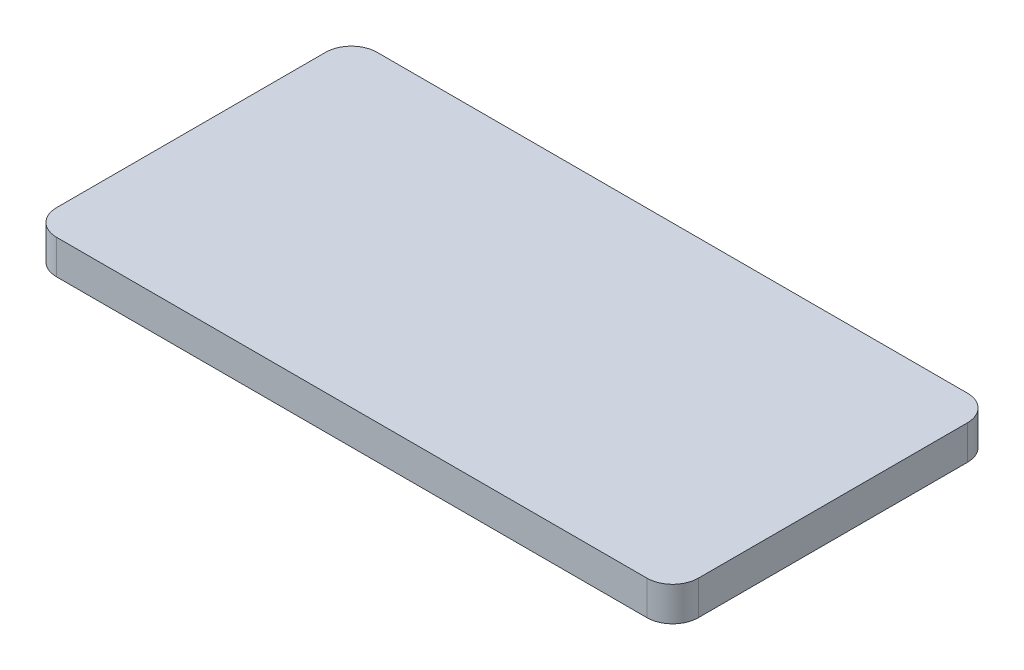
ISO-10303-21;
HEADER;
FILE_DESCRIPTION(('STEP AP214'),'2;1');
FILE_NAME('part.step','',(''),(''),'','','');
FILE_SCHEMA(('AUTOMOTIVE_DESIGN { 1 0 10303 214 1 1 1 1 }'));
ENDSEC;
DATA;
#1=APPLICATION_CONTEXT('core data for automotive mechanical design processes');
#2=APPLICATION_PROTOCOL_DEFINITION('international standard','automotive_design',2000,#1);
#3=PRODUCT_CONTEXT('',#1,'mechanical');
#4=PRODUCT('Part','Part','',(#3));
#5=PRODUCT_RELATED_PRODUCT_CATEGORY('part','',(#4));
#6=PRODUCT_DEFINITION_FORMATION('','',#4);
#7=PRODUCT_DEFINITION_CONTEXT('part definition',#1,'design');
#8=PRODUCT_DEFINITION('design','',#6,#7);
#9=PRODUCT_DEFINITION_SHAPE('','',#8);
#10=(LENGTH_UNIT() NAMED_UNIT(*) SI_UNIT(.MILLI.,.METRE.));
#11=(NAMED_UNIT(*) PLANE_ANGLE_UNIT() SI_UNIT($,.RADIAN.));
#12=(NAMED_UNIT(*) SI_UNIT($,.STERADIAN.) SOLID_ANGLE_UNIT());
#13=UNCERTAINTY_MEASURE_WITH_UNIT(LENGTH_MEASURE(1.E-05),#10,'distance_accuracy_value','');
#14=(GEOMETRIC_REPRESENTATION_CONTEXT(3) GLOBAL_UNCERTAINTY_ASSIGNED_CONTEXT((#13)) GLOBAL_UNIT_ASSIGNED_CONTEXT((#10,
#11,#12)) REPRESENTATION_CONTEXT('',''));
#15=CARTESIAN_POINT('',(0.,0.,0.));
#16=DIRECTION('',(0.,0.,1.));
#17=DIRECTION('',(1.,0.,0.));
#18=AXIS2_PLACEMENT_3D('',#15,#16,#17);
#19=CARTESIAN_POINT('',(143.8,0.,6.));
#20=DIRECTION('',(0.,-1.,0.));
#21=DIRECTION('',(0.,0.,-1.));
#22=AXIS2_PLACEMENT_3D('',#19,#20,#21);
#23=PLANE('',#22);
#24=CARTESIAN_POINT('',(19.,0.,37.4));
#25=DIRECTION('',(0.,-1.,0.));
#26=DIRECTION('',(0.,0.,-1.));
#27=AXIS2_PLACEMENT_3D('',#24,#25,#26);
#28=CIRCLE('',#27,3.59999999999999);
#29=CARTESIAN_POINT('',(19.,0.,41.));
#30=VERTEX_POINT('',#29);
#31=EDGE_CURVE('E130',#30,#30,#28,.T.);
#32=ORIENTED_EDGE('',*,*,#31,.F.);
#33=EDGE_LOOP('',(#32));
#34=FACE_BOUND('',#33,.T.);
#35=CARTESIAN_POINT('',(63.2,0.,9.34999999999999));
#36=DIRECTION('',(0.,-1.,0.));
#37=DIRECTION('',(0.,0.,-1.));
#38=AXIS2_PLACEMENT_3D('',#35,#36,#37);
#39=CIRCLE('',#38,1.65);
#40=CARTESIAN_POINT('',(63.2,0.,7.69999999999998));
#41=VERTEX_POINT('',#40);
#42=EDGE_CURVE('E162',#41,#41,#39,.T.);
#43=ORIENTED_EDGE('',*,*,#42,.F.);
#44=EDGE_LOOP('',(#43));
#45=FACE_BOUND('',#44,.T.);
#46=CARTESIAN_POINT('',(103.2,0.,64.25));
#47=DIRECTION('',(0.,-1.,0.));
#48=DIRECTION('',(0.,0.,-1.));
#49=AXIS2_PLACEMENT_3D('',#46,#47,#48);
#50=CIRCLE('',#49,1.65);
#51=CARTESIAN_POINT('',(103.2,0.,62.6));
#52=VERTEX_POINT('',#51);
#53=EDGE_CURVE('E169',#52,#52,#50,.T.);
#54=ORIENTED_EDGE('',*,*,#53,.F.);
#55=EDGE_LOOP('',(#54));
#56=FACE_BOUND('',#55,.T.);
#57=CARTESIAN_POINT('',(63.2,0.,64.25));
#58=DIRECTION('',(0.,-1.,0.));
#59=DIRECTION('',(0.,0.,-1.));
#60=AXIS2_PLACEMENT_3D('',#57,#58,#59);
#61=CIRCLE('',#60,1.65);
#62=CARTESIAN_POINT('',(63.2,0.,62.6));
#63=VERTEX_POINT('',#62);
#64=EDGE_CURVE('E175',#63,#63,#61,.T.);
#65=ORIENTED_EDGE('',*,*,#64,.F.);
#66=EDGE_LOOP('',(#65));
#67=FACE_BOUND('',#66,.T.);
#68=CARTESIAN_POINT('',(103.2,0.,9.34999999999999));
#69=DIRECTION('',(0.,-1.,0.));
#70=DIRECTION('',(0.,0.,-1.));
#71=AXIS2_PLACEMENT_3D('',#68,#69,#70);
#72=CIRCLE('',#71,1.65);
#73=CARTESIAN_POINT('',(103.2,0.,7.69999999999999));
#74=VERTEX_POINT('',#73);
#75=EDGE_CURVE('E165',#74,#74,#72,.T.);
#76=ORIENTED_EDGE('',*,*,#75,.F.);
#77=EDGE_LOOP('',(#76));
#78=FACE_BOUND('',#77,.T.);
#79=CARTESIAN_POINT('',(5.05,0.,3.24999999999999));
#80=DIRECTION('',(0.,-1.,0.));
#81=DIRECTION('',(0.,0.,-1.));
#82=AXIS2_PLACEMENT_3D('',#79,#80,#81);
#83=CIRCLE('',#82,1.25000000000001);
#84=CARTESIAN_POINT('',(5.05,0.,1.99999999999998));
#85=VERTEX_POINT('',#84);
#86=EDGE_CURVE('E186',#85,#85,#83,.T.);
#87=ORIENTED_EDGE('',*,*,#86,.F.);
#88=EDGE_LOOP('',(#87));
#89=FACE_BOUND('',#88,.T.);
#90=CARTESIAN_POINT('',(5.05,0.,71.05));
#91=DIRECTION('',(0.,-1.,0.));
#92=DIRECTION('',(0.,0.,-1.));
#93=AXIS2_PLACEMENT_3D('',#90,#91,#92);
#94=CIRCLE('',#93,1.25000000000001);
#95=CARTESIAN_POINT('',(5.05,0.,69.8));
#96=VERTEX_POINT('',#95);
#97=EDGE_CURVE('E192',#96,#96,#94,.T.);
#98=ORIENTED_EDGE('',*,*,#97,.F.);
#99=EDGE_LOOP('',(#98));
#100=FACE_BOUND('',#99,.T.);
#101=CARTESIAN_POINT('',(22.8,0.,70.3));
#102=DIRECTION('',(0.,-1.,0.));
#103=DIRECTION('',(0.,0.,-1.));
#104=AXIS2_PLACEMENT_3D('',#101,#102,#103);
#105=CIRCLE('',#104,1.25000000000001);
#106=CARTESIAN_POINT('',(22.8,0.,69.05));
#107=VERTEX_POINT('',#106);
#108=EDGE_CURVE('E198',#107,#107,#105,.T.);
#109=ORIENTED_EDGE('',*,*,#108,.F.);
#110=EDGE_LOOP('',(#109));
#111=FACE_BOUND('',#110,.T.);
#112=CARTESIAN_POINT('',(48.1,0.,68.75));
#113=DIRECTION('',(0.,-1.,0.));
#114=DIRECTION('',(0.,0.,-1.));
#115=AXIS2_PLACEMENT_3D('',#112,#113,#114);
#116=CIRCLE('',#115,1.25);
#117=CARTESIAN_POINT('',(48.1,0.,67.5));
#118=VERTEX_POINT('',#117);
#119=EDGE_CURVE('E204',#118,#118,#116,.T.);
#120=ORIENTED_EDGE('',*,*,#119,.F.);
#121=EDGE_LOOP('',(#120));
#122=FACE_BOUND('',#121,.T.);
#123=CARTESIAN_POINT('',(47.7,0.,4.84999999999999));
#124=DIRECTION('',(0.,-1.,0.));
#125=DIRECTION('',(0.,0.,-1.));
#126=AXIS2_PLACEMENT_3D('',#123,#124,#125);
#127=CIRCLE('',#126,1.25);
#128=CARTESIAN_POINT('',(47.7,0.,3.59999999999999));
#129=VERTEX_POINT('',#128);
#130=EDGE_CURVE('E210',#129,#129,#127,.T.);
#131=ORIENTED_EDGE('',*,*,#130,.F.);
#132=EDGE_LOOP('',(#131));
#133=FACE_BOUND('',#132,.T.);
#134=CARTESIAN_POINT('',(131.1,0.,55.65));
#135=DIRECTION('',(0.,-1.,0.));
#136=DIRECTION('',(0.,0.,-1.));
#137=AXIS2_PLACEMENT_3D('',#134,#135,#136);
#138=CIRCLE('',#137,1.25000000000001);
#139=CARTESIAN_POINT('',(131.1,0.,54.4));
#140=VERTEX_POINT('',#139);
#141=EDGE_CURVE('E216',#140,#140,#138,.T.);
#142=ORIENTED_EDGE('',*,*,#141,.F.);
#143=EDGE_LOOP('',(#142));
#144=FACE_BOUND('',#143,.T.);
#145=CARTESIAN_POINT('',(130.8,0.,5.59999999999999));
#146=DIRECTION('',(0.,-1.,0.));
#147=DIRECTION('',(0.,0.,-1.));
#148=AXIS2_PLACEMENT_3D('',#145,#146,#147);
#149=CIRCLE('',#148,1.25000000000001);
#150=CARTESIAN_POINT('',(130.8,0.,4.34999999999998));
#151=VERTEX_POINT('',#150);
#152=EDGE_CURVE('E219',#151,#151,#149,.T.);
#153=ORIENTED_EDGE('',*,*,#152,.F.);
#154=EDGE_LOOP('',(#153));
#155=FACE_BOUND('',#154,.T.);
#156=CARTESIAN_POINT('',(143.8,0.,6.));
#157=DIRECTION('',(0.,1.,0.));
#158=DIRECTION('',(0.,0.,-1.));
#159=AXIS2_PLACEMENT_3D('',#156,#157,#158);
#160=CIRCLE('',#159,6.);
#161=CARTESIAN_POINT('',(149.8,0.,6.));
#162=VERTEX_POINT('',#161);
#163=CARTESIAN_POINT('',(143.8,0.,0.));
#164=VERTEX_POINT('',#163);
#165=EDGE_CURVE('E225',#162,#164,#160,.T.);
#166=ORIENTED_EDGE('',*,*,#165,.F.);
#167=DIRECTION('',(0.,0.,-1.));
#168=VECTOR('',#167,1.);
#169=CARTESIAN_POINT('',(149.8,0.,6.));
#170=LINE('',#169,#168);
#171=CARTESIAN_POINT('',(149.8,0.,68.8));
#172=VERTEX_POINT('',#171);
#173=EDGE_CURVE('E232',#172,#162,#170,.T.);
#174=ORIENTED_EDGE('',*,*,#173,.F.);
#175=CARTESIAN_POINT('',(143.8,0.,68.8));
#176=DIRECTION('',(0.,1.,0.));
#177=DIRECTION('',(0.,0.,1.));
#178=AXIS2_PLACEMENT_3D('',#175,#176,#177);
#179=CIRCLE('',#178,6.00000000000001);
#180=CARTESIAN_POINT('',(143.8,0.,74.8));
#181=VERTEX_POINT('',#180);
#182=EDGE_CURVE('E259',#181,#172,#179,.T.);
#183=ORIENTED_EDGE('',*,*,#182,.F.);
#184=DIRECTION('',(1.,0.,0.));
#185=VECTOR('',#184,1.);
#186=CARTESIAN_POINT('',(6.00000000000001,0.,74.8));
#187=LINE('',#186,#185);
#188=CARTESIAN_POINT('',(6.00000000000001,0.,74.8));
#189=VERTEX_POINT('',#188);
#190=EDGE_CURVE('E257',#189,#181,#187,.T.);
#191=ORIENTED_EDGE('',*,*,#190,.F.);
#192=CARTESIAN_POINT('',(6.00000000000001,0.,68.8));
#193=DIRECTION('',(0.,1.,0.));
#194=DIRECTION('',(0.,0.,1.));
#195=AXIS2_PLACEMENT_3D('',#192,#193,#194);
#196=CIRCLE('',#195,6.);
#197=CARTESIAN_POINT('',(0.,0.,68.8));
#198=VERTEX_POINT('',#197);
#199=EDGE_CURVE('E255',#198,#189,#196,.T.);
#200=ORIENTED_EDGE('',*,*,#199,.F.);
#201=DIRECTION('',(0.,0.,1.));
#202=VECTOR('',#201,1.);
#203=CARTESIAN_POINT('',(0.,0.,6.));
#204=LINE('',#203,#202);
#205=CARTESIAN_POINT('',(0.,0.,6.));
#206=VERTEX_POINT('',#205);
#207=EDGE_CURVE('E253',#206,#198,#204,.T.);
#208=ORIENTED_EDGE('',*,*,#207,.F.);
#209=CARTESIAN_POINT('',(6.,0.,6.));
#210=DIRECTION('',(0.,1.,0.));
#211=DIRECTION('',(0.,0.,1.));
#212=AXIS2_PLACEMENT_3D('',#209,#210,#211);
#213=CIRCLE('',#212,6.);
#214=CARTESIAN_POINT('',(6.,0.,0.));
#215=VERTEX_POINT('',#214);
#216=EDGE_CURVE('E251',#215,#206,#213,.T.);
#217=ORIENTED_EDGE('',*,*,#216,.F.);
#218=DIRECTION('',(-1.,0.,0.));
#219=VECTOR('',#218,1.);
#220=CARTESIAN_POINT('',(6.,0.,0.));
#221=LINE('',#220,#219);
#222=EDGE_CURVE('E249',#164,#215,#221,.T.);
#223=ORIENTED_EDGE('',*,*,#222,.F.);
#224=EDGE_LOOP('',(#166,#174,#183,#191,#200,#208,#217,#223));
#225=FACE_BOUND('',#224,.T.);
#226=DIRECTION('',(-1.,0.,0.));
#227=VECTOR('',#226,1.);
#228=CARTESIAN_POINT('',(30.8,0.,40.15));
#229=LINE('',#228,#227);
#230=CARTESIAN_POINT('',(30.8,0.,40.15));
#231=VERTEX_POINT('',#230);
#232=CARTESIAN_POINT('',(27.3,0.,40.15));
#233=VERTEX_POINT('',#232);
#234=EDGE_CURVE('E52',#231,#233,#229,.T.);
#235=ORIENTED_EDGE('',*,*,#234,.F.);
#236=DIRECTION('',(0.,0.,1.));
#237=VECTOR('',#236,1.);
#238=CARTESIAN_POINT('',(30.8,0.,34.65));
#239=LINE('',#238,#237);
#240=CARTESIAN_POINT('',(30.8,0.,34.65));
#241=VERTEX_POINT('',#240);
#242=EDGE_CURVE('E123',#241,#231,#239,.T.);
#243=ORIENTED_EDGE('',*,*,#242,.F.);
#244=DIRECTION('',(-1.,0.,0.));
#245=VECTOR('',#244,1.);
#246=CARTESIAN_POINT('',(30.8,0.,34.65));
#247=LINE('',#246,#245);
#248=CARTESIAN_POINT('',(27.3,0.,34.65));
#249=VERTEX_POINT('',#248);
#250=EDGE_CURVE('E126',#241,#249,#247,.T.);
#251=ORIENTED_EDGE('',*,*,#250,.T.);
#252=DIRECTION('',(0.,0.,1.));
#253=VECTOR('',#252,1.);
#254=CARTESIAN_POINT('',(27.3,0.,34.65));
#255=LINE('',#254,#253);
#256=EDGE_CURVE('E57',#249,#233,#255,.T.);
#257=ORIENTED_EDGE('',*,*,#256,.T.);
#258=EDGE_LOOP('',(#235,#243,#251,#257));
#259=FACE_BOUND('',#258,.T.);
#260=ADVANCED_FACE('F37',(#34,#45,#56,#67,#78,#89,#100,#111,#122,#133,#144,#155,#225,#259),#23,.T.);
#261=CARTESIAN_POINT('',(143.8,8.,6.));
#262=DIRECTION('',(0.,-1.,0.));
#263=DIRECTION('',(0.,0.,-1.));
#264=AXIS2_PLACEMENT_3D('',#261,#262,#263);
#265=CYLINDRICAL_SURFACE('',#264,6.);
#266=ORIENTED_EDGE('',*,*,#165,.T.);
#267=DIRECTION('',(0.,-1.,0.));
#268=VECTOR('',#267,1.);
#269=CARTESIAN_POINT('',(143.8,8.,0.));
#270=LINE('',#269,#268);
#271=CARTESIAN_POINT('',(143.8,8.,0.));
#272=VERTEX_POINT('',#271);
#273=EDGE_CURVE('E11',#272,#164,#270,.T.);
#274=ORIENTED_EDGE('',*,*,#273,.F.);
#275=CARTESIAN_POINT('',(143.8,8.,6.));
#276=DIRECTION('',(0.,1.,0.));
#277=DIRECTION('',(0.,0.,-1.));
#278=AXIS2_PLACEMENT_3D('',#275,#276,#277);
#279=CIRCLE('',#278,6.);
#280=CARTESIAN_POINT('',(149.8,8.,6.));
#281=VERTEX_POINT('',#280);
#282=EDGE_CURVE('E228',#281,#272,#279,.T.);
#283=ORIENTED_EDGE('',*,*,#282,.F.);
#284=DIRECTION('',(0.,-1.,0.));
#285=VECTOR('',#284,1.);
#286=CARTESIAN_POINT('',(149.8,8.,6.));
#287=LINE('',#286,#285);
#288=EDGE_CURVE('E246',#281,#162,#287,.T.);
#289=ORIENTED_EDGE('',*,*,#288,.T.);
#290=EDGE_LOOP('',(#266,#274,#283,#289));
#291=FACE_BOUND('',#290,.T.);
#292=ADVANCED_FACE('F39',(#291),#265,.T.);
#293=CARTESIAN_POINT('',(6.,8.,0.));
#294=DIRECTION('',(0.,0.,1.));
#295=DIRECTION('',(1.,0.,0.));
#296=AXIS2_PLACEMENT_3D('',#293,#294,#295);
#297=PLANE('',#296);
#298=ORIENTED_EDGE('',*,*,#222,.T.);
#299=DIRECTION('',(0.,-1.,0.));
#300=VECTOR('',#299,1.);
#301=CARTESIAN_POINT('',(6.,8.,0.));
#302=LINE('',#301,#300);
#303=CARTESIAN_POINT('',(6.,8.,0.));
#304=VERTEX_POINT('',#303);
#305=EDGE_CURVE('E45',#304,#215,#302,.T.);
#306=ORIENTED_EDGE('',*,*,#305,.F.);
#307=DIRECTION('',(-1.,0.,0.));
#308=VECTOR('',#307,1.);
#309=CARTESIAN_POINT('',(6.,8.,0.));
#310=LINE('',#309,#308);
#311=EDGE_CURVE('E231',#272,#304,#310,.T.);
#312=ORIENTED_EDGE('',*,*,#311,.F.);
#313=ORIENTED_EDGE('',*,*,#273,.T.);
#314=EDGE_LOOP('',(#298,#306,#312,#313));
#315=FACE_BOUND('',#314,.T.);
#316=ADVANCED_FACE('F305',(#315),#297,.F.);
#317=CARTESIAN_POINT('',(6.,8.,6.));
#318=DIRECTION('',(0.,-1.,0.));
#319=DIRECTION('',(0.,0.,-1.));
#320=AXIS2_PLACEMENT_3D('',#317,#318,#319);
#321=CYLINDRICAL_SURFACE('',#320,6.);
#322=ORIENTED_EDGE('',*,*,#216,.T.);
#323=DIRECTION('',(0.,-1.,0.));
#324=VECTOR('',#323,1.);
#325=CARTESIAN_POINT('',(0.,8.,6.));
#326=LINE('',#325,#324);
#327=CARTESIAN_POINT('',(0.,8.,6.));
#328=VERTEX_POINT('',#327);
#329=EDGE_CURVE('E276',#328,#206,#326,.T.);
#330=ORIENTED_EDGE('',*,*,#329,.F.);
#331=CARTESIAN_POINT('',(6.,8.,6.));
#332=DIRECTION('',(0.,1.,0.));
#333=DIRECTION('',(0.,0.,1.));
#334=AXIS2_PLACEMENT_3D('',#331,#332,#333);
#335=CIRCLE('',#334,6.);
#336=EDGE_CURVE('E234',#304,#328,#335,.T.);
#337=ORIENTED_EDGE('',*,*,#336,.F.);
#338=ORIENTED_EDGE('',*,*,#305,.T.);
#339=EDGE_LOOP('',(#322,#330,#337,#338));
#340=FACE_BOUND('',#339,.T.);
#341=ADVANCED_FACE('F283',(#340),#321,.T.);
#342=CARTESIAN_POINT('',(0.,8.,6.));
#343=DIRECTION('',(1.,0.,0.));
#344=DIRECTION('',(0.,0.,-1.));
#345=AXIS2_PLACEMENT_3D('',#342,#343,#344);
#346=PLANE('',#345);
#347=ORIENTED_EDGE('',*,*,#207,.T.);
#348=DIRECTION('',(0.,-1.,0.));
#349=VECTOR('',#348,1.);
#350=CARTESIAN_POINT('',(0.,8.,68.8));
#351=LINE('',#350,#349);
#352=CARTESIAN_POINT('',(0.,8.,68.8));
#353=VERTEX_POINT('',#352);
#354=EDGE_CURVE('E273',#353,#198,#351,.T.);
#355=ORIENTED_EDGE('',*,*,#354,.F.);
#356=DIRECTION('',(0.,0.,1.));
#357=VECTOR('',#356,1.);
#358=CARTESIAN_POINT('',(0.,8.,6.));
#359=LINE('',#358,#357);
#360=EDGE_CURVE('E236',#328,#353,#359,.T.);
#361=ORIENTED_EDGE('',*,*,#360,.F.);
#362=ORIENTED_EDGE('',*,*,#329,.T.);
#363=EDGE_LOOP('',(#347,#355,#361,#362));
#364=FACE_BOUND('',#363,.T.);
#365=ADVANCED_FACE('F293',(#364),#346,.F.);
#366=CARTESIAN_POINT('',(6.00000000000001,8.,68.8));
#367=DIRECTION('',(0.,-1.,0.));
#368=DIRECTION('',(0.,0.,-1.));
#369=AXIS2_PLACEMENT_3D('',#366,#367,#368);
#370=CYLINDRICAL_SURFACE('',#369,6.);
#371=ORIENTED_EDGE('',*,*,#199,.T.);
#372=DIRECTION('',(0.,-1.,0.));
#373=VECTOR('',#372,1.);
#374=CARTESIAN_POINT('',(6.00000000000001,8.,74.8));
#375=LINE('',#374,#373);
#376=CARTESIAN_POINT('',(6.00000000000001,8.,74.8));
#377=VERTEX_POINT('',#376);
#378=EDGE_CURVE('E270',#377,#189,#375,.T.);
#379=ORIENTED_EDGE('',*,*,#378,.F.);
#380=CARTESIAN_POINT('',(6.00000000000001,8.,68.8));
#381=DIRECTION('',(0.,1.,0.));
#382=DIRECTION('',(0.,0.,1.));
#383=AXIS2_PLACEMENT_3D('',#380,#381,#382);
#384=CIRCLE('',#383,6.);
#385=EDGE_CURVE('E238',#353,#377,#384,.T.);
#386=ORIENTED_EDGE('',*,*,#385,.F.);
#387=ORIENTED_EDGE('',*,*,#354,.T.);
#388=EDGE_LOOP('',(#371,#379,#386,#387));
#389=FACE_BOUND('',#388,.T.);
#390=ADVANCED_FACE('F297',(#389),#370,.T.);
#391=CARTESIAN_POINT('',(6.00000000000001,8.,74.8));
#392=DIRECTION('',(0.,0.,-1.));
#393=DIRECTION('',(-1.,0.,0.));
#394=AXIS2_PLACEMENT_3D('',#391,#392,#393);
#395=PLANE('',#394);
#396=ORIENTED_EDGE('',*,*,#190,.T.);
#397=DIRECTION('',(0.,-1.,0.));
#398=VECTOR('',#397,1.);
#399=CARTESIAN_POINT('',(143.8,8.,74.8));
#400=LINE('',#399,#398);
#401=CARTESIAN_POINT('',(143.8,8.,74.8));
#402=VERTEX_POINT('',#401);
#403=EDGE_CURVE('E267',#402,#181,#400,.T.);
#404=ORIENTED_EDGE('',*,*,#403,.F.);
#405=DIRECTION('',(1.,0.,0.));
#406=VECTOR('',#405,1.);
#407=CARTESIAN_POINT('',(6.00000000000001,8.,74.8));
#408=LINE('',#407,#406);
#409=EDGE_CURVE('E240',#377,#402,#408,.T.);
#410=ORIENTED_EDGE('',*,*,#409,.F.);
#411=ORIENTED_EDGE('',*,*,#378,.T.);
#412=EDGE_LOOP('',(#396,#404,#410,#411));
#413=FACE_BOUND('',#412,.T.);
#414=ADVANCED_FACE('F318',(#413),#395,.F.);
#415=CARTESIAN_POINT('',(143.8,8.,68.8));
#416=DIRECTION('',(0.,-1.,0.));
#417=DIRECTION('',(0.,0.,-1.));
#418=AXIS2_PLACEMENT_3D('',#415,#416,#417);
#419=CYLINDRICAL_SURFACE('',#418,6.00000000000001);
#420=ORIENTED_EDGE('',*,*,#182,.T.);
#421=DIRECTION('',(0.,-1.,0.));
#422=VECTOR('',#421,1.);
#423=CARTESIAN_POINT('',(149.8,8.,68.8));
#424=LINE('',#423,#422);
#425=CARTESIAN_POINT('',(149.8,8.,68.8));
#426=VERTEX_POINT('',#425);
#427=EDGE_CURVE('E264',#426,#172,#424,.T.);
#428=ORIENTED_EDGE('',*,*,#427,.F.);
#429=CARTESIAN_POINT('',(143.8,8.,68.8));
#430=DIRECTION('',(0.,1.,0.));
#431=DIRECTION('',(0.,0.,1.));
#432=AXIS2_PLACEMENT_3D('',#429,#430,#431);
#433=CIRCLE('',#432,6.00000000000001);
#434=EDGE_CURVE('E242',#402,#426,#433,.T.);
#435=ORIENTED_EDGE('',*,*,#434,.F.);
#436=ORIENTED_EDGE('',*,*,#403,.T.);
#437=EDGE_LOOP('',(#420,#428,#435,#436));
#438=FACE_BOUND('',#437,.T.);
#439=ADVANCED_FACE('F316',(#438),#419,.T.);
#440=CARTESIAN_POINT('',(149.8,8.,6.));
#441=DIRECTION('',(-1.,0.,0.));
#442=DIRECTION('',(0.,0.,1.));
#443=AXIS2_PLACEMENT_3D('',#440,#441,#442);
#444=PLANE('',#443);
#445=ORIENTED_EDGE('',*,*,#173,.T.);
#446=ORIENTED_EDGE('',*,*,#288,.F.);
#447=DIRECTION('',(0.,0.,-1.));
#448=VECTOR('',#447,1.);
#449=CARTESIAN_POINT('',(149.8,8.,6.));
#450=LINE('',#449,#448);
#451=EDGE_CURVE('E244',#426,#281,#450,.T.);
#452=ORIENTED_EDGE('',*,*,#451,.F.);
#453=ORIENTED_EDGE('',*,*,#427,.T.);
#454=EDGE_LOOP('',(#445,#446,#452,#453));
#455=FACE_BOUND('',#454,.T.);
#456=ADVANCED_FACE('F311',(#455),#444,.F.);
#457=CARTESIAN_POINT('',(143.8,8.,6.));
#458=DIRECTION('',(0.,-1.,0.));
#459=DIRECTION('',(0.,0.,-1.));
#460=AXIS2_PLACEMENT_3D('',#457,#458,#459);
#461=PLANE('',#460);
#462=ORIENTED_EDGE('',*,*,#282,.T.);
#463=ORIENTED_EDGE('',*,*,#311,.T.);
#464=ORIENTED_EDGE('',*,*,#336,.T.);
#465=ORIENTED_EDGE('',*,*,#360,.T.);
#466=ORIENTED_EDGE('',*,*,#385,.T.);
#467=ORIENTED_EDGE('',*,*,#409,.T.);
#468=ORIENTED_EDGE('',*,*,#434,.T.);
#469=ORIENTED_EDGE('',*,*,#451,.T.);
#470=EDGE_LOOP('',(#462,#463,#464,#465,#466,#467,#468,#469));
#471=FACE_BOUND('',#470,.T.);
#472=ADVANCED_FACE('F301',(#471),#461,.F.);
#473=CARTESIAN_POINT('',(130.8,-2.5,5.59999999999999));
#474=DIRECTION('',(0.,1.,0.));
#475=DIRECTION('',(0.,0.,1.));
#476=AXIS2_PLACEMENT_3D('',#473,#474,#475);
#477=CYLINDRICAL_SURFACE('',#476,1.25000000000001);
#478=CARTESIAN_POINT('',(130.8,-2.5,5.59999999999999));
#479=DIRECTION('',(0.,-1.,0.));
#480=DIRECTION('',(0.,0.,-1.));
#481=AXIS2_PLACEMENT_3D('',#478,#479,#480);
#482=CIRCLE('',#481,1.25000000000001);
#483=CARTESIAN_POINT('',(130.8,-2.5,4.34999999999998));
#484=VERTEX_POINT('',#483);
#485=EDGE_CURVE('E222',#484,#484,#482,.T.);
#486=ORIENTED_EDGE('',*,*,#485,.F.);
#487=EDGE_LOOP('',(#486));
#488=FACE_BOUND('',#487,.T.);
#489=ORIENTED_EDGE('',*,*,#152,.T.);
#490=EDGE_LOOP('',(#489));
#491=FACE_BOUND('',#490,.T.);
#492=ADVANCED_FACE('F342',(#488,#491),#477,.T.);
#493=CARTESIAN_POINT('',(130.8,-2.5,5.59999999999999));
#494=DIRECTION('',(0.,-1.,0.));
#495=DIRECTION('',(0.,0.,-1.));
#496=AXIS2_PLACEMENT_3D('',#493,#494,#495);
#497=PLANE('',#496);
#498=ORIENTED_EDGE('',*,*,#485,.T.);
#499=EDGE_LOOP('',(#498));
#500=FACE_BOUND('',#499,.T.);
#501=ADVANCED_FACE('F346',(#500),#497,.T.);
#502=CARTESIAN_POINT('',(131.1,-2.5,55.65));
#503=DIRECTION('',(0.,1.,0.));
#504=DIRECTION('',(0.,0.,1.));
#505=AXIS2_PLACEMENT_3D('',#502,#503,#504);
#506=CYLINDRICAL_SURFACE('',#505,1.25000000000001);
#507=CARTESIAN_POINT('',(131.1,-2.5,55.65));
#508=DIRECTION('',(0.,-1.,0.));
#509=DIRECTION('',(0.,0.,-1.));
#510=AXIS2_PLACEMENT_3D('',#507,#508,#509);
#511=CIRCLE('',#510,1.25000000000001);
#512=CARTESIAN_POINT('',(131.1,-2.5,54.4));
#513=VERTEX_POINT('',#512);
#514=EDGE_CURVE('E213',#513,#513,#511,.T.);
#515=ORIENTED_EDGE('',*,*,#514,.F.);
#516=EDGE_LOOP('',(#515));
#517=FACE_BOUND('',#516,.T.);
#518=ORIENTED_EDGE('',*,*,#141,.T.);
#519=EDGE_LOOP('',(#518));
#520=FACE_BOUND('',#519,.T.);
#521=ADVANCED_FACE('F351',(#517,#520),#506,.T.);
#522=CARTESIAN_POINT('',(131.1,-2.5,55.65));
#523=DIRECTION('',(0.,-1.,0.));
#524=DIRECTION('',(0.,0.,-1.));
#525=AXIS2_PLACEMENT_3D('',#522,#523,#524);
#526=PLANE('',#525);
#527=ORIENTED_EDGE('',*,*,#514,.T.);
#528=EDGE_LOOP('',(#527));
#529=FACE_BOUND('',#528,.T.);
#530=ADVANCED_FACE('F357',(#529),#526,.T.);
#531=CARTESIAN_POINT('',(47.7,-2.5,4.84999999999999));
#532=DIRECTION('',(0.,1.,0.));
#533=DIRECTION('',(0.,0.,1.));
#534=AXIS2_PLACEMENT_3D('',#531,#532,#533);
#535=CYLINDRICAL_SURFACE('',#534,1.25);
#536=CARTESIAN_POINT('',(47.7,-2.5,4.84999999999999));
#537=DIRECTION('',(0.,-1.,0.));
#538=DIRECTION('',(0.,0.,-1.));
#539=AXIS2_PLACEMENT_3D('',#536,#537,#538);
#540=CIRCLE('',#539,1.25);
#541=CARTESIAN_POINT('',(47.7,-2.5,3.59999999999999));
#542=VERTEX_POINT('',#541);
#543=EDGE_CURVE('E207',#542,#542,#540,.T.);
#544=ORIENTED_EDGE('',*,*,#543,.F.);
#545=EDGE_LOOP('',(#544));
#546=FACE_BOUND('',#545,.T.);
#547=ORIENTED_EDGE('',*,*,#130,.T.);
#548=EDGE_LOOP('',(#547));
#549=FACE_BOUND('',#548,.T.);
#550=ADVANCED_FACE('F360',(#546,#549),#535,.T.);
#551=CARTESIAN_POINT('',(47.7,-2.5,4.84999999999999));
#552=DIRECTION('',(0.,-1.,0.));
#553=DIRECTION('',(0.,0.,-1.));
#554=AXIS2_PLACEMENT_3D('',#551,#552,#553);
#555=PLANE('',#554);
#556=ORIENTED_EDGE('',*,*,#543,.T.);
#557=EDGE_LOOP('',(#556));
#558=FACE_BOUND('',#557,.T.);
#559=ADVANCED_FACE('F365',(#558),#555,.T.);
#560=CARTESIAN_POINT('',(48.1,-2.5,68.75));
#561=DIRECTION('',(0.,1.,0.));
#562=DIRECTION('',(0.,0.,1.));
#563=AXIS2_PLACEMENT_3D('',#560,#561,#562);
#564=CYLINDRICAL_SURFACE('',#563,1.25);
#565=CARTESIAN_POINT('',(48.1,-2.5,68.75));
#566=DIRECTION('',(0.,-1.,0.));
#567=DIRECTION('',(0.,0.,-1.));
#568=AXIS2_PLACEMENT_3D('',#565,#566,#567);
#569=CIRCLE('',#568,1.25);
#570=CARTESIAN_POINT('',(48.1,-2.5,67.5));
#571=VERTEX_POINT('',#570);
#572=EDGE_CURVE('E201',#571,#571,#569,.T.);
#573=ORIENTED_EDGE('',*,*,#572,.F.);
#574=EDGE_LOOP('',(#573));
#575=FACE_BOUND('',#574,.T.);
#576=ORIENTED_EDGE('',*,*,#119,.T.);
#577=EDGE_LOOP('',(#576));
#578=FACE_BOUND('',#577,.T.);
#579=ADVANCED_FACE('F368',(#575,#578),#564,.T.);
#580=CARTESIAN_POINT('',(48.1,-2.5,68.75));
#581=DIRECTION('',(0.,-1.,0.));
#582=DIRECTION('',(0.,0.,-1.));
#583=AXIS2_PLACEMENT_3D('',#580,#581,#582);
#584=PLANE('',#583);
#585=ORIENTED_EDGE('',*,*,#572,.T.);
#586=EDGE_LOOP('',(#585));
#587=FACE_BOUND('',#586,.T.);
#588=ADVANCED_FACE('F373',(#587),#584,.T.);
#589=CARTESIAN_POINT('',(22.8,-2.5,70.3));
#590=DIRECTION('',(0.,1.,0.));
#591=DIRECTION('',(0.,0.,1.));
#592=AXIS2_PLACEMENT_3D('',#589,#590,#591);
#593=CYLINDRICAL_SURFACE('',#592,1.25000000000001);
#594=CARTESIAN_POINT('',(22.8,-2.5,70.3));
#595=DIRECTION('',(0.,-1.,0.));
#596=DIRECTION('',(0.,0.,-1.));
#597=AXIS2_PLACEMENT_3D('',#594,#595,#596);
#598=CIRCLE('',#597,1.25000000000001);
#599=CARTESIAN_POINT('',(22.8,-2.5,69.05));
#600=VERTEX_POINT('',#599);
#601=EDGE_CURVE('E195',#600,#600,#598,.T.);
#602=ORIENTED_EDGE('',*,*,#601,.F.);
#603=EDGE_LOOP('',(#602));
#604=FACE_BOUND('',#603,.T.);
#605=ORIENTED_EDGE('',*,*,#108,.T.);
#606=EDGE_LOOP('',(#605));
#607=FACE_BOUND('',#606,.T.);
#608=ADVANCED_FACE('F376',(#604,#607),#593,.T.);
#609=CARTESIAN_POINT('',(22.8,-2.5,70.3));
#610=DIRECTION('',(0.,-1.,0.));
#611=DIRECTION('',(0.,0.,-1.));
#612=AXIS2_PLACEMENT_3D('',#609,#610,#611);
#613=PLANE('',#612);
#614=ORIENTED_EDGE('',*,*,#601,.T.);
#615=EDGE_LOOP('',(#614));
#616=FACE_BOUND('',#615,.T.);
#617=ADVANCED_FACE('F381',(#616),#613,.T.);
#618=CARTESIAN_POINT('',(5.05,-2.5,71.05));
#619=DIRECTION('',(0.,1.,0.));
#620=DIRECTION('',(0.,0.,1.));
#621=AXIS2_PLACEMENT_3D('',#618,#619,#620);
#622=CYLINDRICAL_SURFACE('',#621,1.25000000000001);
#623=CARTESIAN_POINT('',(5.05,-2.5,71.05));
#624=DIRECTION('',(0.,-1.,0.));
#625=DIRECTION('',(0.,0.,-1.));
#626=AXIS2_PLACEMENT_3D('',#623,#624,#625);
#627=CIRCLE('',#626,1.25000000000001);
#628=CARTESIAN_POINT('',(5.05,-2.5,69.8));
#629=VERTEX_POINT('',#628);
#630=EDGE_CURVE('E189',#629,#629,#627,.T.);
#631=ORIENTED_EDGE('',*,*,#630,.F.);
#632=EDGE_LOOP('',(#631));
#633=FACE_BOUND('',#632,.T.);
#634=ORIENTED_EDGE('',*,*,#97,.T.);
#635=EDGE_LOOP('',(#634));
#636=FACE_BOUND('',#635,.T.);
#637=ADVANCED_FACE('F384',(#633,#636),#622,.T.);
#638=CARTESIAN_POINT('',(5.05,-2.5,71.05));
#639=DIRECTION('',(0.,-1.,0.));
#640=DIRECTION('',(0.,0.,-1.));
#641=AXIS2_PLACEMENT_3D('',#638,#639,#640);
#642=PLANE('',#641);
#643=ORIENTED_EDGE('',*,*,#630,.T.);
#644=EDGE_LOOP('',(#643));
#645=FACE_BOUND('',#644,.T.);
#646=ADVANCED_FACE('F389',(#645),#642,.T.);
#647=CARTESIAN_POINT('',(5.05,-2.5,3.24999999999999));
#648=DIRECTION('',(0.,1.,0.));
#649=DIRECTION('',(0.,0.,1.));
#650=AXIS2_PLACEMENT_3D('',#647,#648,#649);
#651=CYLINDRICAL_SURFACE('',#650,1.25000000000001);
#652=CARTESIAN_POINT('',(5.05,-2.5,3.24999999999999));
#653=DIRECTION('',(0.,-1.,0.));
#654=DIRECTION('',(0.,0.,-1.));
#655=AXIS2_PLACEMENT_3D('',#652,#653,#654);
#656=CIRCLE('',#655,1.25000000000001);
#657=CARTESIAN_POINT('',(5.05,-2.5,1.99999999999998));
#658=VERTEX_POINT('',#657);
#659=EDGE_CURVE('E183',#658,#658,#656,.T.);
#660=ORIENTED_EDGE('',*,*,#659,.F.);
#661=EDGE_LOOP('',(#660));
#662=FACE_BOUND('',#661,.T.);
#663=ORIENTED_EDGE('',*,*,#86,.T.);
#664=EDGE_LOOP('',(#663));
#665=FACE_BOUND('',#664,.T.);
#666=ADVANCED_FACE('F392',(#662,#665),#651,.T.);
#667=CARTESIAN_POINT('',(5.05,-2.5,3.24999999999999));
#668=DIRECTION('',(0.,-1.,0.));
#669=DIRECTION('',(0.,0.,-1.));
#670=AXIS2_PLACEMENT_3D('',#667,#668,#669);
#671=PLANE('',#670);
#672=ORIENTED_EDGE('',*,*,#659,.T.);
#673=EDGE_LOOP('',(#672));
#674=FACE_BOUND('',#673,.T.);
#675=ADVANCED_FACE('F397',(#674),#671,.T.);
#676=CARTESIAN_POINT('',(103.2,4.,9.34999999999999));
#677=DIRECTION('',(0.,-1.,0.));
#678=DIRECTION('',(0.,0.,-1.));
#679=AXIS2_PLACEMENT_3D('',#676,#677,#678);
#680=CYLINDRICAL_SURFACE('',#679,1.65);
#681=CARTESIAN_POINT('',(103.2,4.,9.34999999999999));
#682=DIRECTION('',(0.,-1.,0.));
#683=DIRECTION('',(0.,0.,-1.));
#684=AXIS2_PLACEMENT_3D('',#681,#682,#683);
#685=CIRCLE('',#684,1.65);
#686=CARTESIAN_POINT('',(103.2,4.,7.69999999999999));
#687=VERTEX_POINT('',#686);
#688=EDGE_CURVE('E180',#687,#687,#685,.T.);
#689=ORIENTED_EDGE('',*,*,#688,.F.);
#690=EDGE_LOOP('',(#689));
#691=FACE_BOUND('',#690,.T.);
#692=ORIENTED_EDGE('',*,*,#75,.T.);
#693=EDGE_LOOP('',(#692));
#694=FACE_BOUND('',#693,.T.);
#695=ADVANCED_FACE('F400',(#691,#694),#680,.F.);
#696=CARTESIAN_POINT('',(103.2,4.,9.34999999999999));
#697=DIRECTION('',(0.,-1.,0.));
#698=DIRECTION('',(0.,0.,-1.));
#699=AXIS2_PLACEMENT_3D('',#696,#697,#698);
#700=PLANE('',#699);
#701=ORIENTED_EDGE('',*,*,#688,.T.);
#702=EDGE_LOOP('',(#701));
#703=FACE_BOUND('',#702,.T.);
#704=ADVANCED_FACE('F407',(#703),#700,.T.);
#705=CARTESIAN_POINT('',(63.2,4.,64.25));
#706=DIRECTION('',(0.,-1.,0.));
#707=DIRECTION('',(0.,0.,-1.));
#708=AXIS2_PLACEMENT_3D('',#705,#706,#707);
#709=CYLINDRICAL_SURFACE('',#708,1.65);
#710=CARTESIAN_POINT('',(63.2,4.,64.25));
#711=DIRECTION('',(0.,-1.,0.));
#712=DIRECTION('',(0.,0.,-1.));
#713=AXIS2_PLACEMENT_3D('',#710,#711,#712);
#714=CIRCLE('',#713,1.65);
#715=CARTESIAN_POINT('',(63.2,4.,62.6));
#716=VERTEX_POINT('',#715);
#717=EDGE_CURVE('E159',#716,#716,#714,.T.);
#718=ORIENTED_EDGE('',*,*,#717,.F.);
#719=EDGE_LOOP('',(#718));
#720=FACE_BOUND('',#719,.T.);
#721=ORIENTED_EDGE('',*,*,#64,.T.);
#722=EDGE_LOOP('',(#721));
#723=FACE_BOUND('',#722,.T.);
#724=ADVANCED_FACE('F411',(#720,#723),#709,.F.);
#725=CARTESIAN_POINT('',(63.2,4.,64.25));
#726=DIRECTION('',(0.,-1.,0.));
#727=DIRECTION('',(0.,0.,-1.));
#728=AXIS2_PLACEMENT_3D('',#725,#726,#727);
#729=PLANE('',#728);
#730=ORIENTED_EDGE('',*,*,#717,.T.);
#731=EDGE_LOOP('',(#730));
#732=FACE_BOUND('',#731,.T.);
#733=ADVANCED_FACE('F413',(#732),#729,.T.);
#734=CARTESIAN_POINT('',(103.2,4.,64.25));
#735=DIRECTION('',(0.,-1.,0.));
#736=DIRECTION('',(0.,0.,-1.));
#737=AXIS2_PLACEMENT_3D('',#734,#735,#736);
#738=CYLINDRICAL_SURFACE('',#737,1.65);
#739=CARTESIAN_POINT('',(103.2,4.,64.25));
#740=DIRECTION('',(0.,-1.,0.));
#741=DIRECTION('',(0.,0.,-1.));
#742=AXIS2_PLACEMENT_3D('',#739,#740,#741);
#743=CIRCLE('',#742,1.65);
#744=CARTESIAN_POINT('',(103.2,4.,62.6));
#745=VERTEX_POINT('',#744);
#746=EDGE_CURVE('E172',#745,#745,#743,.T.);
#747=ORIENTED_EDGE('',*,*,#746,.F.);
#748=EDGE_LOOP('',(#747));
#749=FACE_BOUND('',#748,.T.);
#750=ORIENTED_EDGE('',*,*,#53,.T.);
#751=EDGE_LOOP('',(#750));
#752=FACE_BOUND('',#751,.T.);
#753=ADVANCED_FACE('F416',(#749,#752),#738,.F.);
#754=CARTESIAN_POINT('',(103.2,4.,64.25));
#755=DIRECTION('',(0.,-1.,0.));
#756=DIRECTION('',(0.,0.,-1.));
#757=AXIS2_PLACEMENT_3D('',#754,#755,#756);
#758=PLANE('',#757);
#759=ORIENTED_EDGE('',*,*,#746,.T.);
#760=EDGE_LOOP('',(#759));
#761=FACE_BOUND('',#760,.T.);
#762=ADVANCED_FACE('F421',(#761),#758,.T.);
#763=CARTESIAN_POINT('',(63.2,4.,9.34999999999999));
#764=DIRECTION('',(0.,-1.,0.));
#765=DIRECTION('',(0.,0.,-1.));
#766=AXIS2_PLACEMENT_3D('',#763,#764,#765);
#767=CYLINDRICAL_SURFACE('',#766,1.65);
#768=CARTESIAN_POINT('',(63.2,4.,9.34999999999999));
#769=DIRECTION('',(0.,-1.,0.));
#770=DIRECTION('',(0.,0.,-1.));
#771=AXIS2_PLACEMENT_3D('',#768,#769,#770);
#772=CIRCLE('',#771,1.65);
#773=CARTESIAN_POINT('',(63.2,4.,7.69999999999998));
#774=VERTEX_POINT('',#773);
#775=EDGE_CURVE('E166',#774,#774,#772,.T.);
#776=ORIENTED_EDGE('',*,*,#775,.F.);
#777=EDGE_LOOP('',(#776));
#778=FACE_BOUND('',#777,.T.);
#779=ORIENTED_EDGE('',*,*,#42,.T.);
#780=EDGE_LOOP('',(#779));
#781=FACE_BOUND('',#780,.T.);
#782=ADVANCED_FACE('F424',(#778,#781),#767,.F.);
#783=CARTESIAN_POINT('',(63.2,4.,9.34999999999999));
#784=DIRECTION('',(0.,-1.,0.));
#785=DIRECTION('',(0.,0.,-1.));
#786=AXIS2_PLACEMENT_3D('',#783,#784,#785);
#787=PLANE('',#786);
#788=ORIENTED_EDGE('',*,*,#775,.T.);
#789=EDGE_LOOP('',(#788));
#790=FACE_BOUND('',#789,.T.);
#791=ADVANCED_FACE('F429',(#790),#787,.T.);
#792=CARTESIAN_POINT('',(19.,-6.5,37.4));
#793=DIRECTION('',(0.,1.,0.));
#794=DIRECTION('',(0.,0.,1.));
#795=AXIS2_PLACEMENT_3D('',#792,#793,#794);
#796=CYLINDRICAL_SURFACE('',#795,3.59999999999999);
#797=CARTESIAN_POINT('',(19.,-6.5,37.4));
#798=DIRECTION('',(0.,-1.,0.));
#799=DIRECTION('',(0.,0.,-1.));
#800=AXIS2_PLACEMENT_3D('',#797,#798,#799);
#801=CIRCLE('',#800,3.59999999999999);
#802=CARTESIAN_POINT('',(19.,-6.5,41.));
#803=VERTEX_POINT('',#802);
#804=EDGE_CURVE('E156',#803,#803,#801,.T.);
#805=CARTESIAN_POINT('',(19.,-6.5,41.));
#806=CARTESIAN_POINT('',(19.,-6.43229166666667,41.));
#807=CARTESIAN_POINT('',(19.,-6.36458333333333,41.));
#808=CARTESIAN_POINT('',(19.,-6.22916666666667,41.));
#809=CARTESIAN_POINT('',(19.,-6.16145833333333,41.));
#810=CARTESIAN_POINT('',(19.,-6.02604166666667,41.));
#811=CARTESIAN_POINT('',(19.,-5.95833333333333,41.));
#812=CARTESIAN_POINT('',(19.,-5.82291666666667,41.));
#813=CARTESIAN_POINT('',(19.,-5.75520833333333,41.));
#814=CARTESIAN_POINT('',(19.,-5.61979166666667,41.));
#815=CARTESIAN_POINT('',(19.,-5.55208333333333,41.));
#816=CARTESIAN_POINT('',(19.,-5.41666666666667,41.));
#817=CARTESIAN_POINT('',(19.,-5.34895833333333,41.));
#818=CARTESIAN_POINT('',(19.,-5.21354166666667,41.));
#819=CARTESIAN_POINT('',(19.,-5.14583333333333,41.));
#820=CARTESIAN_POINT('',(19.,-5.01041666666667,41.));
#821=CARTESIAN_POINT('',(19.,-4.94270833333333,41.));
#822=CARTESIAN_POINT('',(19.,-4.80729166666667,41.));
#823=CARTESIAN_POINT('',(19.,-4.73958333333333,41.));
#824=CARTESIAN_POINT('',(19.,-4.60416666666667,41.));
#825=CARTESIAN_POINT('',(19.,-4.53645833333333,41.));
#826=CARTESIAN_POINT('',(19.,-4.40104166666667,41.));
#827=CARTESIAN_POINT('',(19.,-4.33333333333333,41.));
#828=CARTESIAN_POINT('',(19.,-4.19791666666667,41.));
#829=CARTESIAN_POINT('',(19.,-4.13020833333333,41.));
#830=CARTESIAN_POINT('',(19.,-3.99479166666667,41.));
#831=CARTESIAN_POINT('',(19.,-3.92708333333333,41.));
#832=CARTESIAN_POINT('',(19.,-3.79166666666667,41.));
#833=CARTESIAN_POINT('',(19.,-3.72395833333333,41.));
#834=CARTESIAN_POINT('',(19.,-3.58854166666667,41.));
#835=CARTESIAN_POINT('',(19.,-3.52083333333333,41.));
#836=CARTESIAN_POINT('',(19.,-3.38541666666667,41.));
#837=CARTESIAN_POINT('',(19.,-3.31770833333333,41.));
#838=CARTESIAN_POINT('',(19.,-3.18229166666667,41.));
#839=CARTESIAN_POINT('',(19.,-3.11458333333333,41.));
#840=CARTESIAN_POINT('',(19.,-2.97916666666667,41.));
#841=CARTESIAN_POINT('',(19.,-2.91145833333333,41.));
#842=CARTESIAN_POINT('',(19.,-2.77604166666667,41.));
#843=CARTESIAN_POINT('',(19.,-2.70833333333333,41.));
#844=CARTESIAN_POINT('',(19.,-2.57291666666667,41.));
#845=CARTESIAN_POINT('',(19.,-2.50520833333333,41.));
#846=CARTESIAN_POINT('',(19.,-2.36979166666667,41.));
#847=CARTESIAN_POINT('',(19.,-2.30208333333333,41.));
#848=CARTESIAN_POINT('',(19.,-2.16666666666667,41.));
#849=CARTESIAN_POINT('',(19.,-2.09895833333333,41.));
#850=CARTESIAN_POINT('',(19.,-1.96354166666667,41.));
#851=CARTESIAN_POINT('',(19.,-1.89583333333333,41.));
#852=CARTESIAN_POINT('',(19.,-1.76041666666667,41.));
#853=CARTESIAN_POINT('',(19.,-1.69270833333333,41.));
#854=CARTESIAN_POINT('',(19.,-1.55729166666667,41.));
#855=CARTESIAN_POINT('',(19.,-1.48958333333333,41.));
#856=CARTESIAN_POINT('',(19.,-1.35416666666667,41.));
#857=CARTESIAN_POINT('',(19.,-1.28645833333333,41.));
#858=CARTESIAN_POINT('',(19.,-1.15104166666667,41.));
#859=CARTESIAN_POINT('',(19.,-1.08333333333333,41.));
#860=CARTESIAN_POINT('',(19.,-0.947916666666667,41.));
#861=CARTESIAN_POINT('',(19.,-0.880208333333333,41.));
#862=CARTESIAN_POINT('',(19.,-0.744791666666667,41.));
#863=CARTESIAN_POINT('',(19.,-0.677083333333333,41.));
#864=CARTESIAN_POINT('',(19.,-0.541666666666667,41.));
#865=CARTESIAN_POINT('',(19.,-0.473958333333333,41.));
#866=CARTESIAN_POINT('',(19.,-0.338541666666667,41.));
#867=CARTESIAN_POINT('',(19.,-0.270833333333334,41.));
#868=CARTESIAN_POINT('',(19.,-0.135416666666667,41.));
#869=CARTESIAN_POINT('',(19.,-0.0677083333333334,41.));
#870=CARTESIAN_POINT('',(19.,0.,41.));
#871=B_SPLINE_CURVE_WITH_KNOTS('',3,(#805,#806,#807,#808,#809,#810,#811,#812,#813,#814,#815,
#816,#817,#818,#819,#820,#821,#822,#823,#824,#825,#826,#827,#828,#829,#830,#831,#832,#833,#834,
#835,#836,#837,#838,#839,#840,#841,#842,#843,#844,#845,#846,#847,#848,#849,#850,#851,#852,#853,
#854,#855,#856,#857,#858,#859,#860,#861,#862,#863,#864,#865,#866,#867,#868,#869,#870),
.UNSPECIFIED.,.F.,.F.,(4,2,2,2,2,2,2,2,2,2,2,2,2,2,2,2,2,2,2,2,2,2,2,2,2,2,2,2,2,2,2,2,4),(0.,
0.203125,0.40625,0.609375000000001,0.812500000000001,1.015625,1.21875,1.421875,1.625,1.828125,
2.03125,2.234375,2.4375,2.640625,2.84375,3.046875,3.25,3.453125,3.65625,3.859375,4.0625,
4.265625,4.46875,4.671875,4.875,5.078125,5.28125,5.484375,5.6875,5.890625,6.09375,6.296875,6.5),.UNSPECIFIED.);
#872=EDGE_CURVE('BSEAM432',#803,#30,#871,.T.);
#873=ORIENTED_EDGE('',*,*,#804,.F.);
#874=ORIENTED_EDGE('',*,*,#31,.T.);
#875=ORIENTED_EDGE('',*,*,#872,.T.);
#876=ORIENTED_EDGE('',*,*,#872,.F.);
#877=EDGE_LOOP('',(#873,#875,#874,#876));
#878=FACE_BOUND('',#877,.T.);
#879=ADVANCED_FACE('F432',(#878),#796,.T.);
#880=CARTESIAN_POINT('',(19.,-6.5,37.4));
#881=DIRECTION('',(0.,-1.,0.));
#882=DIRECTION('',(0.,0.,-1.));
#883=AXIS2_PLACEMENT_3D('',#880,#881,#882);
#884=PLANE('',#883);
#885=ORIENTED_EDGE('',*,*,#804,.T.);
#886=EDGE_LOOP('',(#885));
#887=FACE_BOUND('',#886,.T.);
#888=ADVANCED_FACE('F439',(#887),#884,.T.);
#889=CARTESIAN_POINT('',(30.8,-6.5,34.65));
#890=DIRECTION('',(-1.,0.,0.));
#891=DIRECTION('',(0.,0.,1.));
#892=AXIS2_PLACEMENT_3D('',#889,#890,#891);
#893=PLANE('',#892);
#894=ORIENTED_EDGE('',*,*,#242,.T.);
#895=DIRECTION('',(0.,1.,0.));
#896=VECTOR('',#895,1.);
#897=CARTESIAN_POINT('',(30.8,-6.5,40.15));
#898=LINE('',#897,#896);
#899=CARTESIAN_POINT('',(30.8,-6.5,40.15));
#900=VERTEX_POINT('',#899);
#901=EDGE_CURVE('E690',#900,#231,#898,.T.);
#902=ORIENTED_EDGE('',*,*,#901,.F.);
#903=DIRECTION('',(0.,0.,1.));
#904=VECTOR('',#903,1.);
#905=CARTESIAN_POINT('',(30.8,-6.5,34.65));
#906=LINE('',#905,#904);
#907=CARTESIAN_POINT('',(30.8,-6.5,34.65));
#908=VERTEX_POINT('',#907);
#909=EDGE_CURVE('E136',#908,#900,#906,.T.);
#910=ORIENTED_EDGE('',*,*,#909,.F.);
#911=DIRECTION('',(0.,1.,0.));
#912=VECTOR('',#911,1.);
#913=CARTESIAN_POINT('',(30.8,-6.5,34.65));
#914=LINE('',#913,#912);
#915=EDGE_CURVE('E133',#908,#241,#914,.T.);
#916=ORIENTED_EDGE('',*,*,#915,.T.);
#917=EDGE_LOOP('',(#894,#902,#910,#916));
#918=FACE_BOUND('',#917,.T.);
#919=ADVANCED_FACE('F134',(#918),#893,.F.);
#920=CARTESIAN_POINT('',(30.8,-6.5,40.15));
#921=DIRECTION('',(0.,0.,-1.));
#922=DIRECTION('',(-1.,0.,0.));
#923=AXIS2_PLACEMENT_3D('',#920,#921,#922);
#924=PLANE('',#923);
#925=ORIENTED_EDGE('',*,*,#234,.T.);
#926=DIRECTION('',(0.,1.,0.));
#927=VECTOR('',#926,1.);
#928=CARTESIAN_POINT('',(27.3,-6.5,40.15));
#929=LINE('',#928,#927);
#930=CARTESIAN_POINT('',(27.3,-6.5,40.15));
#931=VERTEX_POINT('',#930);
#932=EDGE_CURVE('E689',#931,#233,#929,.T.);
#933=ORIENTED_EDGE('',*,*,#932,.F.);
#934=DIRECTION('',(-1.,0.,0.));
#935=VECTOR('',#934,1.);
#936=CARTESIAN_POINT('',(30.8,-6.5,40.15));
#937=LINE('',#936,#935);
#938=EDGE_CURVE('E146',#900,#931,#937,.T.);
#939=ORIENTED_EDGE('',*,*,#938,.F.);
#940=ORIENTED_EDGE('',*,*,#901,.T.);
#941=EDGE_LOOP('',(#925,#933,#939,#940));
#942=FACE_BOUND('',#941,.T.);
#943=ADVANCED_FACE('F453',(#942),#924,.F.);
#944=CARTESIAN_POINT('',(27.3,-6.5,34.65));
#945=DIRECTION('',(-1.,0.,0.));
#946=DIRECTION('',(0.,0.,1.));
#947=AXIS2_PLACEMENT_3D('',#944,#945,#946);
#948=PLANE('',#947);
#949=ORIENTED_EDGE('',*,*,#256,.F.);
#950=DIRECTION('',(0.,1.,0.));
#951=VECTOR('',#950,1.);
#952=CARTESIAN_POINT('',(27.3,-6.5,34.65));
#953=LINE('',#952,#951);
#954=CARTESIAN_POINT('',(27.3,-6.5,34.65));
#955=VERTEX_POINT('',#954);
#956=EDGE_CURVE('E141',#955,#249,#953,.T.);
#957=ORIENTED_EDGE('',*,*,#956,.F.);
#958=DIRECTION('',(0.,0.,1.));
#959=VECTOR('',#958,1.);
#960=CARTESIAN_POINT('',(27.3,-6.5,34.65));
#961=LINE('',#960,#959);
#962=EDGE_CURVE('E152',#955,#931,#961,.T.);
#963=ORIENTED_EDGE('',*,*,#962,.T.);
#964=ORIENTED_EDGE('',*,*,#932,.T.);
#965=EDGE_LOOP('',(#949,#957,#963,#964));
#966=FACE_BOUND('',#965,.T.);
#967=ADVANCED_FACE('F450',(#966),#948,.T.);
#968=CARTESIAN_POINT('',(30.8,-6.5,34.65));
#969=DIRECTION('',(0.,0.,-1.));
#970=DIRECTION('',(-1.,0.,0.));
#971=AXIS2_PLACEMENT_3D('',#968,#969,#970);
#972=PLANE('',#971);
#973=ORIENTED_EDGE('',*,*,#250,.F.);
#974=ORIENTED_EDGE('',*,*,#915,.F.);
#975=DIRECTION('',(-1.,0.,0.));
#976=VECTOR('',#975,1.);
#977=CARTESIAN_POINT('',(30.8,-6.5,34.65));
#978=LINE('',#977,#976);
#979=EDGE_CURVE('E140',#908,#955,#978,.T.);
#980=ORIENTED_EDGE('',*,*,#979,.T.);
#981=ORIENTED_EDGE('',*,*,#956,.T.);
#982=EDGE_LOOP('',(#973,#974,#980,#981));
#983=FACE_BOUND('',#982,.T.);
#984=ADVANCED_FACE('F143',(#983),#972,.T.);
#985=CARTESIAN_POINT('',(0.,-6.5,0.));
#986=DIRECTION('',(0.,-1.,0.));
#987=DIRECTION('',(0.,0.,-1.));
#988=AXIS2_PLACEMENT_3D('',#985,#986,#987);
#989=PLANE('',#988);
#990=ORIENTED_EDGE('',*,*,#909,.T.);
#991=ORIENTED_EDGE('',*,*,#938,.T.);
#992=ORIENTED_EDGE('',*,*,#962,.F.);
#993=ORIENTED_EDGE('',*,*,#979,.F.);
#994=EDGE_LOOP('',(#990,#991,#992,#993));
#995=FACE_BOUND('',#994,.T.);
#996=ADVANCED_FACE('F444',(#995),#989,.T.);
#997=CLOSED_SHELL('',(#260,#292,#316,#341,#365,#390,#414,#439,#456,#472,#492,#501,#521,#530,
#550,#559,#579,#588,#608,#617,#637,#646,#666,#675,#695,#704,#724,#733,#753,#762,#782,#791,#879,
#888,#919,#943,#967,#984,#996));
#998=MANIFOLD_SOLID_BREP('B2',#997);
#999=ADVANCED_BREP_SHAPE_REPRESENTATION('',(#18,#998),#14);
#1000=SHAPE_DEFINITION_REPRESENTATION(#9,#999);
ENDSEC;
END-ISO-10303-21;
